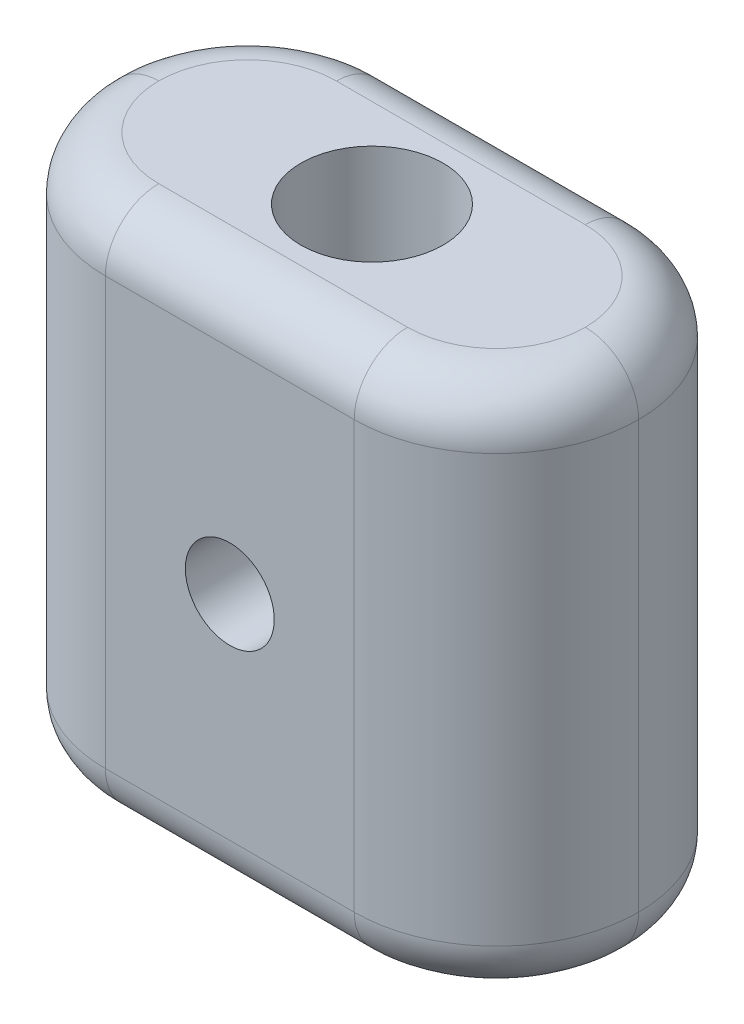
ISO-10303-21;
HEADER;
FILE_DESCRIPTION(('STEP AP214'),'2;1');
FILE_NAME('part.step','',(''),(''),'','','');
FILE_SCHEMA(('AUTOMOTIVE_DESIGN { 1 0 10303 214 1 1 1 1 }'));
ENDSEC;
DATA;
#1=APPLICATION_CONTEXT('core data for automotive mechanical design processes');
#2=APPLICATION_PROTOCOL_DEFINITION('international standard','automotive_design',2000,#1);
#3=PRODUCT_CONTEXT('',#1,'mechanical');
#4=PRODUCT('Part','Part','',(#3));
#5=PRODUCT_RELATED_PRODUCT_CATEGORY('part','',(#4));
#6=PRODUCT_DEFINITION_FORMATION('','',#4);
#7=PRODUCT_DEFINITION_CONTEXT('part definition',#1,'design');
#8=PRODUCT_DEFINITION('design','',#6,#7);
#9=PRODUCT_DEFINITION_SHAPE('','',#8);
#10=(LENGTH_UNIT() NAMED_UNIT(*) SI_UNIT(.MILLI.,.METRE.));
#11=(NAMED_UNIT(*) PLANE_ANGLE_UNIT() SI_UNIT($,.RADIAN.));
#12=(NAMED_UNIT(*) SI_UNIT($,.STERADIAN.) SOLID_ANGLE_UNIT());
#13=UNCERTAINTY_MEASURE_WITH_UNIT(LENGTH_MEASURE(1.E-05),#10,'distance_accuracy_value','');
#14=(GEOMETRIC_REPRESENTATION_CONTEXT(3) GLOBAL_UNCERTAINTY_ASSIGNED_CONTEXT((#13)) GLOBAL_UNIT_ASSIGNED_CONTEXT((#10,
#11,#12)) REPRESENTATION_CONTEXT('',''));
#15=CARTESIAN_POINT('',(0.,0.,0.));
#16=DIRECTION('',(0.,0.,1.));
#17=DIRECTION('',(1.,0.,0.));
#18=AXIS2_PLACEMENT_3D('',#15,#16,#17);
#19=CARTESIAN_POINT('',(15.,15.,16.));
#20=DIRECTION('',(0.,0.,-1.));
#21=DIRECTION('',(-1.,0.,0.));
#22=AXIS2_PLACEMENT_3D('',#19,#20,#21);
#23=CYLINDRICAL_SURFACE('',#22,2.5);
#24=CARTESIAN_POINT('',(12.5,15.,11.1224989991992));
#25=CARTESIAN_POINT('',(12.5000005890286,15.0621567514455,11.1224999155542));
#26=CARTESIAN_POINT('',(12.5023241805783,15.1243259466708,11.1243649073392));
#27=CARTESIAN_POINT('',(12.5115665015914,15.2481171795477,11.1317292311903));
#28=CARTESIAN_POINT('',(12.5184879375157,15.3097388732571,11.1372307038136));
#29=CARTESIAN_POINT('',(12.5460240494164,15.4932260477437,11.158889535585));
#30=CARTESIAN_POINT('',(12.5734100905354,15.613548331189,11.1802003627114));
#31=CARTESIAN_POINT('',(12.644237828588,15.8455981978782,11.2329977076037));
#32=CARTESIAN_POINT('',(12.687540386408,15.9573904150551,11.2643957538321));
#33=CARTESIAN_POINT('',(12.788560835691,16.1720085253341,11.3336600088444));
#34=CARTESIAN_POINT('',(12.8462791203698,16.2748341737531,11.3715263940553));
#35=CARTESIAN_POINT('',(12.9835231757442,16.4837339813037,11.4555922512188));
#36=CARTESIAN_POINT('',(13.0649357433305,16.5883933250045,11.5022281451158));
#37=CARTESIAN_POINT('',(13.2433747334257,16.7837615516238,11.5950550353337));
#38=CARTESIAN_POINT('',(13.3404146110022,16.8744582799536,11.6412456115844));
#39=CARTESIAN_POINT('',(13.5616600941715,17.0502202981727,11.7345952477131));
#40=CARTESIAN_POINT('',(13.6877306574035,17.1332861844504,11.781198877815));
#41=CARTESIAN_POINT('',(13.8883660445657,17.2405451547362,11.8430725183877));
#42=CARTESIAN_POINT('',(13.957187590259,17.2734151383331,11.8623628309205));
#43=CARTESIAN_POINT('',(14.0982412323844,17.3329546853633,11.8977043697544));
#44=CARTESIAN_POINT('',(14.1704709316062,17.3596285310384,11.9137578320712));
#45=CARTESIAN_POINT('',(14.3102997020834,17.4039838152563,11.9406675911382));
#46=CARTESIAN_POINT('',(14.3776280187214,17.4223019765181,11.9518853598447));
#47=CARTESIAN_POINT('',(14.5140024241012,17.4533022863134,11.9709624190916));
#48=CARTESIAN_POINT('',(14.5830474965583,17.4659876892162,11.9788236487972));
#49=CARTESIAN_POINT('',(14.7222345501428,17.4855137976345,11.9909547033474));
#50=CARTESIAN_POINT('',(14.7923758257561,17.4923581165134,11.9952267484783));
#51=CARTESIAN_POINT('',(14.9330885533401,17.5000992133892,12.0000612507244));
#52=CARTESIAN_POINT('',(15.0036599548603,17.5009966759633,12.0006241348225));
#53=CARTESIAN_POINT('',(15.1960450815555,17.4952746264527,11.997044796195));
#54=CARTESIAN_POINT('',(15.3176818454885,17.4826934969211,11.9891704089744));
#55=CARTESIAN_POINT('',(15.5566364946203,17.4402697820339,11.9629090327593));
#56=CARTESIAN_POINT('',(15.6739540526774,17.4104258920264,11.9445212492048));
#57=CARTESIAN_POINT('',(15.9017719917639,17.3347914407167,11.8987617071161));
#58=CARTESIAN_POINT('',(16.0122540715961,17.2889600804289,11.8713669738105));
#59=CARTESIAN_POINT('',(16.2240401207122,17.1830627610157,11.8097129175135));
#60=CARTESIAN_POINT('',(16.3253419917424,17.1229935589364,11.7754520308932));
#61=CARTESIAN_POINT('',(16.5294264974466,16.9819435830763,11.6978644124717));
#62=CARTESIAN_POINT('',(16.6308245461291,16.8992907233095,11.6539400638152));
#63=CARTESIAN_POINT('',(16.8191973357306,16.7197352627929,11.5639092774051));
#64=CARTESIAN_POINT('',(16.9061507184262,16.622811953616,11.5177997357041));
#65=CARTESIAN_POINT('',(17.0747088716791,16.4025887468265,11.4214288346447));
#66=CARTESIAN_POINT('',(17.1541322967784,16.2774972366419,11.371411626866));
#67=CARTESIAN_POINT('',(17.2905230755056,16.0127077626986,11.2802827819238));
#68=CARTESIAN_POINT('',(17.347531794485,15.8730373125469,11.2391548038693));
#69=CARTESIAN_POINT('',(17.4243713352793,15.6204611938938,11.1818375313176));
#70=CARTESIAN_POINT('',(17.450036834454,15.5101780747865,11.1619340860251));
#71=CARTESIAN_POINT('',(17.4862033707309,15.2857696224401,11.1335827775955));
#72=CARTESIAN_POINT('',(17.4967251252081,15.1716497573432,11.1251192650444));
#73=CARTESIAN_POINT('',(17.5019707209518,14.9425426394976,11.1209226703068));
#74=CARTESIAN_POINT('',(17.4966583589669,14.8275539995215,11.1252187617019));
#75=CARTESIAN_POINT('',(17.4705146636781,14.6004388356815,11.1459208583619));
#76=CARTESIAN_POINT('',(17.4496704784913,14.4883147616288,11.1623368922291));
#77=CARTESIAN_POINT('',(17.3940987419504,14.2715632405743,11.2046012079714));
#78=CARTESIAN_POINT('',(17.3596057142476,14.1668426841057,11.2302895436782));
#79=CARTESIAN_POINT('',(17.2780489370224,13.9644253001062,11.2883114838875));
#80=CARTESIAN_POINT('',(17.2309807258375,13.866730981122,11.3206474460208));
#81=CARTESIAN_POINT('',(17.1153079873069,13.6613880583368,11.395744012852));
#82=CARTESIAN_POINT('',(17.0443093116054,13.5553854726982,11.4393172429302));
#83=CARTESIAN_POINT('',(16.8873786892149,13.3556293393457,11.5278794321334));
#84=CARTESIAN_POINT('',(16.8014312490262,13.2618886787577,11.5728698200447));
#85=CARTESIAN_POINT('',(16.6007693249212,13.074035929359,11.667662094595));
#86=CARTESIAN_POINT('',(16.4836520161718,12.9822726015151,11.717079338832));
#87=CARTESIAN_POINT('',(16.2325678740781,12.8198529852803,11.8076897339861));
#88=CARTESIAN_POINT('',(16.0986089794097,12.7491868048731,11.8488867361901));
#89=CARTESIAN_POINT('',(15.8919308046551,12.663418932025,11.8998896649978));
#90=CARTESIAN_POINT('',(15.8243181960394,12.6387025560487,11.9147705509724));
#91=CARTESIAN_POINT('',(15.6866407928764,12.5950617232677,11.9412464391862));
#92=CARTESIAN_POINT('',(15.6165774440511,12.5761339138491,11.952843343148));
#93=CARTESIAN_POINT('',(15.4746392314643,12.5443941698607,11.9723851203995));
#94=CARTESIAN_POINT('',(15.4027660057555,12.5315769004836,11.9803331790884));
#95=CARTESIAN_POINT('',(15.2578818071425,12.5122608277071,11.9923416834334));
#96=CARTESIAN_POINT('',(15.1848710244825,12.5057609790692,11.9964027722002));
#97=CARTESIAN_POINT('',(14.9868897225751,12.4969284844929,12.0019152149271));
#98=CARTESIAN_POINT('',(14.8614609207946,12.5007342070906,11.9995270612395));
#99=CARTESIAN_POINT('',(14.6134168628979,12.5269175895455,11.9832197501836));
#100=CARTESIAN_POINT('',(14.4908014793732,12.5492944066788,11.9693011160486));
#101=CARTESIAN_POINT('',(14.2559193945162,12.6103224155461,11.9319208338428));
#102=CARTESIAN_POINT('',(14.1434412473682,12.6483820735647,11.908807010548));
#103=CARTESIAN_POINT('',(13.9265696527808,12.7391194624435,11.8548997124884));
#104=CARTESIAN_POINT('',(13.822177573142,12.7917996595672,11.8241049421531));
#105=CARTESIAN_POINT('',(13.612687022452,12.91632127872,11.7535067393565));
#106=CARTESIAN_POINT('',(13.5086398781622,12.9895839907575,11.7131000186466));
#107=CARTESIAN_POINT('',(13.313566650652,13.1501532325141,11.6286728398521));
#108=CARTESIAN_POINT('',(13.2225554815632,13.2374756088343,11.584648331912));
#109=CARTESIAN_POINT('',(13.0425528343841,13.4382325150619,11.4900082821972));
#110=CARTESIAN_POINT('',(12.9557433874994,13.5536166125714,11.439357384271));
#111=CARTESIAN_POINT('',(12.802453514901,13.7992894097598,11.3434964745711));
#112=CARTESIAN_POINT('',(12.7359618458497,13.9295698111525,11.2982834620419));
#113=CARTESIAN_POINT('',(12.6380177058716,14.1728053007849,11.2285953978009));
#114=CARTESIAN_POINT('',(12.6020754142317,14.2832705721536,11.2017463933877));
#115=CARTESIAN_POINT('',(12.5457438158025,14.5099393430018,11.1587835810451));
#116=CARTESIAN_POINT('',(12.5253052758983,14.6261234197997,11.1426358115043));
#117=CARTESIAN_POINT('',(12.5088015286048,14.7860599946461,11.1295285764061));
#118=CARTESIAN_POINT('',(12.5055056616204,14.8287255257087,11.1268999430677));
#119=CARTESIAN_POINT('',(12.5011044187419,14.9142586989517,11.1233846193986));
#120=CARTESIAN_POINT('',(12.4999995937081,14.9571263892434,11.1224983671287));
#121=CARTESIAN_POINT('',(12.5,15.,11.1224989991992));
#122=B_SPLINE_CURVE_WITH_KNOTS('',3,(#24,#25,#26,#27,#28,#29,#30,#31,#32,#33,#34,#35,#36,#37,
#38,#39,#40,#41,#42,#43,#44,#45,#46,#47,#48,#49,#50,#51,#52,#53,#54,#55,#56,#57,#58,#59,#60,#61,
#62,#63,#64,#65,#66,#67,#68,#69,#70,#71,#72,#73,#74,#75,#76,#77,#78,#79,#80,#81,#82,#83,#84,#85,
#86,#87,#88,#89,#90,#91,#92,#93,#94,#95,#96,#97,#98,#99,#100,#101,#102,#103,#104,#105,#106,#107,
#108,#109,#110,#111,#112,#113,#114,#115,#116,#117,#118,#119,#120,#121),.UNSPECIFIED.,.T.,.F.,(4,
2,2,2,2,2,2,2,2,2,2,2,2,2,2,2,2,2,2,2,2,2,2,2,2,2,2,2,2,2,2,2,2,2,2,2,2,2,2,2,2,2,2,2,2,2,2,2,
4),(0.,0.186415315858459,0.372940459994495,0.746478880764685,1.11682668423132,1.48718459072605,
1.9072279868507,2.32763499192879,2.7987602926597,3.03445880867314,3.26999394209509,
3.48170145743205,3.69328649746503,3.90474055342595,4.11617026725867,4.48184709708114,
4.84755156693919,5.21419620193004,5.58092442797434,5.99329080205307,6.40626158573465,
6.87316206383505,7.33919680735486,7.68265621505465,8.02564530559509,8.36941921026407,
8.7134778886509,9.05186495232125,9.390372235192,9.79332737765187,10.1967026751544,
10.6647326786671,11.1325428866818,11.3527929661039,11.5729152387446,11.7928449800804,
12.0127383271002,12.3871595324234,12.7615637480926,13.1229788842094,13.4844550226785,
13.8834503840958,14.2828986410983,14.7399238503459,15.1966956936287,15.5530255473292,
15.9082190611886,16.0367696833384,16.1653526209168),.UNSPECIFIED.);
#123=CARTESIAN_POINT('',(12.5,15.,11.1224989991992));
#124=VERTEX_POINT('',#123);
#125=EDGE_CURVE('E258',#124,#124,#122,.T.);
#126=ORIENTED_EDGE('',*,*,#125,.T.);
#127=EDGE_LOOP('',(#126));
#128=FACE_BOUND('',#127,.T.);
#129=CARTESIAN_POINT('',(15.,15.,16.));
#130=DIRECTION('',(0.,0.,-1.));
#131=DIRECTION('',(-1.,0.,0.));
#132=AXIS2_PLACEMENT_3D('',#129,#130,#131);
#133=CIRCLE('',#132,2.5);
#134=CARTESIAN_POINT('',(12.5,15.,16.));
#135=VERTEX_POINT('',#134);
#136=EDGE_CURVE('E251',#135,#135,#133,.T.);
#137=ORIENTED_EDGE('',*,*,#136,.F.);
#138=EDGE_LOOP('',(#137));
#139=FACE_BOUND('',#138,.T.);
#140=ADVANCED_FACE('F38',(#128,#139),#23,.F.);
#141=CARTESIAN_POINT('',(0.,0.,16.));
#142=DIRECTION('',(0.,1.,0.));
#143=DIRECTION('',(0.,0.,1.));
#144=AXIS2_PLACEMENT_3D('',#141,#142,#143);
#145=PLANE('',#144);
#146=DIRECTION('',(1.,0.,0.));
#147=VECTOR('',#146,1.);
#148=CARTESIAN_POINT('',(0.,0.,13.));
#149=LINE('',#148,#147);
#150=CARTESIAN_POINT('',(22.,0.,13.));
#151=VERTEX_POINT('',#150);
#152=CARTESIAN_POINT('',(8.,0.,13.));
#153=VERTEX_POINT('',#152);
#154=EDGE_CURVE('E135',#151,#153,#149,.F.);
#155=ORIENTED_EDGE('',*,*,#154,.T.);
#156=CARTESIAN_POINT('',(8.,0.,8.));
#157=DIRECTION('',(0.,1.,0.));
#158=DIRECTION('',(0.,0.,1.));
#159=AXIS2_PLACEMENT_3D('',#156,#157,#158);
#160=CIRCLE('',#159,5.);
#161=CARTESIAN_POINT('',(3.,0.,8.));
#162=VERTEX_POINT('',#161);
#163=EDGE_CURVE('E170',#153,#162,#160,.F.);
#164=ORIENTED_EDGE('',*,*,#163,.T.);
#165=CARTESIAN_POINT('',(8.,0.,8.));
#166=DIRECTION('',(0.,1.,0.));
#167=DIRECTION('',(0.,0.,1.));
#168=AXIS2_PLACEMENT_3D('',#165,#166,#167);
#169=CIRCLE('',#168,5.);
#170=CARTESIAN_POINT('',(8.,0.,3.));
#171=VERTEX_POINT('',#170);
#172=EDGE_CURVE('E168',#162,#171,#169,.F.);
#173=ORIENTED_EDGE('',*,*,#172,.T.);
#174=DIRECTION('',(1.,0.,0.));
#175=VECTOR('',#174,1.);
#176=CARTESIAN_POINT('',(22.,0.,3.));
#177=LINE('',#176,#175);
#178=CARTESIAN_POINT('',(22.,0.,3.));
#179=VERTEX_POINT('',#178);
#180=EDGE_CURVE('E166',#171,#179,#177,.T.);
#181=ORIENTED_EDGE('',*,*,#180,.T.);
#182=CARTESIAN_POINT('',(22.,0.,8.));
#183=DIRECTION('',(0.,1.,0.));
#184=DIRECTION('',(0.,0.,1.));
#185=AXIS2_PLACEMENT_3D('',#182,#183,#184);
#186=CIRCLE('',#185,5.);
#187=CARTESIAN_POINT('',(27.,0.,8.));
#188=VERTEX_POINT('',#187);
#189=EDGE_CURVE('E138',#179,#188,#186,.F.);
#190=ORIENTED_EDGE('',*,*,#189,.T.);
#191=CARTESIAN_POINT('',(22.,0.,8.));
#192=DIRECTION('',(0.,1.,0.));
#193=DIRECTION('',(0.,0.,1.));
#194=AXIS2_PLACEMENT_3D('',#191,#192,#193);
#195=CIRCLE('',#194,5.);
#196=EDGE_CURVE('E129',#188,#151,#195,.F.);
#197=ORIENTED_EDGE('',*,*,#196,.T.);
#198=EDGE_LOOP('',(#155,#164,#173,#181,#190,#197));
#199=FACE_BOUND('',#198,.T.);
#200=CARTESIAN_POINT('',(15.,0.,8.));
#201=DIRECTION('',(0.,1.,0.));
#202=DIRECTION('',(0.,0.,1.));
#203=AXIS2_PLACEMENT_3D('',#200,#201,#202);
#204=CIRCLE('',#203,4.);
#205=CARTESIAN_POINT('',(15.,0.,12.));
#206=VERTEX_POINT('',#205);
#207=EDGE_CURVE('E274',#206,#206,#204,.T.);
#208=ORIENTED_EDGE('',*,*,#207,.T.);
#209=EDGE_LOOP('',(#208));
#210=FACE_BOUND('',#209,.T.);
#211=ADVANCED_FACE('F131',(#199,#210),#145,.F.);
#212=CARTESIAN_POINT('',(0.,30.,16.));
#213=DIRECTION('',(0.,-1.,0.));
#214=DIRECTION('',(0.,0.,-1.));
#215=AXIS2_PLACEMENT_3D('',#212,#213,#214);
#216=PLANE('',#215);
#217=DIRECTION('',(-1.,0.,0.));
#218=VECTOR('',#217,1.);
#219=CARTESIAN_POINT('',(0.,30.,13.));
#220=LINE('',#219,#218);
#221=CARTESIAN_POINT('',(8.,30.,13.));
#222=VERTEX_POINT('',#221);
#223=CARTESIAN_POINT('',(22.,30.,13.));
#224=VERTEX_POINT('',#223);
#225=EDGE_CURVE('E193',#222,#224,#220,.F.);
#226=ORIENTED_EDGE('',*,*,#225,.T.);
#227=CARTESIAN_POINT('',(22.,30.,8.));
#228=DIRECTION('',(0.,-1.,0.));
#229=DIRECTION('',(0.,0.,-1.));
#230=AXIS2_PLACEMENT_3D('',#227,#228,#229);
#231=CIRCLE('',#230,5.);
#232=CARTESIAN_POINT('',(27.,30.,8.));
#233=VERTEX_POINT('',#232);
#234=EDGE_CURVE('E202',#224,#233,#231,.F.);
#235=ORIENTED_EDGE('',*,*,#234,.T.);
#236=CARTESIAN_POINT('',(22.,30.,8.));
#237=DIRECTION('',(0.,-1.,0.));
#238=DIRECTION('',(0.,0.,-1.));
#239=AXIS2_PLACEMENT_3D('',#236,#237,#238);
#240=CIRCLE('',#239,5.);
#241=CARTESIAN_POINT('',(22.,30.,3.));
#242=VERTEX_POINT('',#241);
#243=EDGE_CURVE('E62',#233,#242,#240,.F.);
#244=ORIENTED_EDGE('',*,*,#243,.T.);
#245=DIRECTION('',(-1.,0.,0.));
#246=VECTOR('',#245,1.);
#247=CARTESIAN_POINT('',(8.,30.,3.));
#248=LINE('',#247,#246);
#249=CARTESIAN_POINT('',(8.,30.,3.));
#250=VERTEX_POINT('',#249);
#251=EDGE_CURVE('E199',#242,#250,#248,.T.);
#252=ORIENTED_EDGE('',*,*,#251,.T.);
#253=CARTESIAN_POINT('',(8.,30.,8.));
#254=DIRECTION('',(0.,-1.,0.));
#255=DIRECTION('',(0.,0.,-1.));
#256=AXIS2_PLACEMENT_3D('',#253,#254,#255);
#257=CIRCLE('',#256,5.);
#258=CARTESIAN_POINT('',(3.,30.,8.));
#259=VERTEX_POINT('',#258);
#260=EDGE_CURVE('E197',#250,#259,#257,.F.);
#261=ORIENTED_EDGE('',*,*,#260,.T.);
#262=CARTESIAN_POINT('',(8.,30.,8.));
#263=DIRECTION('',(0.,-1.,0.));
#264=DIRECTION('',(0.,0.,-1.));
#265=AXIS2_PLACEMENT_3D('',#262,#263,#264);
#266=CIRCLE('',#265,5.);
#267=EDGE_CURVE('E195',#259,#222,#266,.F.);
#268=ORIENTED_EDGE('',*,*,#267,.T.);
#269=EDGE_LOOP('',(#226,#235,#244,#252,#261,#268));
#270=FACE_BOUND('',#269,.T.);
#271=CARTESIAN_POINT('',(15.,30.,8.));
#272=DIRECTION('',(0.,1.,0.));
#273=DIRECTION('',(0.,0.,1.));
#274=AXIS2_PLACEMENT_3D('',#271,#272,#273);
#275=CIRCLE('',#274,4.);
#276=CARTESIAN_POINT('',(15.,30.,12.));
#277=VERTEX_POINT('',#276);
#278=EDGE_CURVE('E269',#277,#277,#275,.T.);
#279=ORIENTED_EDGE('',*,*,#278,.F.);
#280=EDGE_LOOP('',(#279));
#281=FACE_BOUND('',#280,.T.);
#282=ADVANCED_FACE('F311',(#270,#281),#216,.F.);
#283=CARTESIAN_POINT('',(0.,0.,16.));
#284=DIRECTION('',(0.,0.,-1.));
#285=DIRECTION('',(-1.,0.,0.));
#286=AXIS2_PLACEMENT_3D('',#283,#284,#285);
#287=PLANE('',#286);
#288=ORIENTED_EDGE('',*,*,#136,.T.);
#289=EDGE_LOOP('',(#288));
#290=FACE_BOUND('',#289,.T.);
#291=DIRECTION('',(0.,-1.,0.));
#292=VECTOR('',#291,1.);
#293=CARTESIAN_POINT('',(8.,0.,16.));
#294=LINE('',#293,#292);
#295=CARTESIAN_POINT('',(8.,27.,16.));
#296=VERTEX_POINT('',#295);
#297=CARTESIAN_POINT('',(8.,3.,16.));
#298=VERTEX_POINT('',#297);
#299=EDGE_CURVE('E159',#296,#298,#294,.T.);
#300=ORIENTED_EDGE('',*,*,#299,.T.);
#301=DIRECTION('',(1.,0.,0.));
#302=VECTOR('',#301,1.);
#303=CARTESIAN_POINT('',(0.,3.,16.));
#304=LINE('',#303,#302);
#305=CARTESIAN_POINT('',(22.,3.,16.));
#306=VERTEX_POINT('',#305);
#307=EDGE_CURVE('E11',#298,#306,#304,.T.);
#308=ORIENTED_EDGE('',*,*,#307,.T.);
#309=DIRECTION('',(0.,1.,0.));
#310=VECTOR('',#309,1.);
#311=CARTESIAN_POINT('',(22.,0.,16.));
#312=LINE('',#311,#310);
#313=CARTESIAN_POINT('',(22.,27.,16.));
#314=VERTEX_POINT('',#313);
#315=EDGE_CURVE('E156',#306,#314,#312,.T.);
#316=ORIENTED_EDGE('',*,*,#315,.T.);
#317=DIRECTION('',(-1.,0.,0.));
#318=VECTOR('',#317,1.);
#319=CARTESIAN_POINT('',(0.,27.,16.));
#320=LINE('',#319,#318);
#321=EDGE_CURVE('E47',#314,#296,#320,.T.);
#322=ORIENTED_EDGE('',*,*,#321,.T.);
#323=EDGE_LOOP('',(#300,#308,#316,#322));
#324=FACE_BOUND('',#323,.T.);
#325=ADVANCED_FACE('F318',(#290,#324),#287,.F.);
#326=CARTESIAN_POINT('',(0.,0.,0.));
#327=DIRECTION('',(0.,0.,-1.));
#328=DIRECTION('',(-1.,0.,0.));
#329=AXIS2_PLACEMENT_3D('',#326,#327,#328);
#330=PLANE('',#329);
#331=CARTESIAN_POINT('',(15.,15.,0.));
#332=DIRECTION('',(0.,0.,-1.));
#333=DIRECTION('',(-1.,0.,0.));
#334=AXIS2_PLACEMENT_3D('',#331,#332,#333);
#335=CIRCLE('',#334,2.5);
#336=CARTESIAN_POINT('',(12.5,15.,0.));
#337=VERTEX_POINT('',#336);
#338=EDGE_CURVE('E255',#337,#337,#335,.T.);
#339=ORIENTED_EDGE('',*,*,#338,.F.);
#340=EDGE_LOOP('',(#339));
#341=FACE_BOUND('',#340,.T.);
#342=DIRECTION('',(0.,1.,0.));
#343=VECTOR('',#342,1.);
#344=CARTESIAN_POINT('',(22.,0.,0.));
#345=LINE('',#344,#343);
#346=CARTESIAN_POINT('',(22.,27.,0.));
#347=VERTEX_POINT('',#346);
#348=CARTESIAN_POINT('',(22.,3.,0.));
#349=VERTEX_POINT('',#348);
#350=EDGE_CURVE('E250',#347,#349,#345,.F.);
#351=ORIENTED_EDGE('',*,*,#350,.T.);
#352=DIRECTION('',(1.,0.,0.));
#353=VECTOR('',#352,1.);
#354=CARTESIAN_POINT('',(8.,3.,0.));
#355=LINE('',#354,#353);
#356=CARTESIAN_POINT('',(8.,3.,0.));
#357=VERTEX_POINT('',#356);
#358=EDGE_CURVE('E183',#349,#357,#355,.F.);
#359=ORIENTED_EDGE('',*,*,#358,.T.);
#360=DIRECTION('',(0.,-1.,0.));
#361=VECTOR('',#360,1.);
#362=CARTESIAN_POINT('',(8.,30.,0.));
#363=LINE('',#362,#361);
#364=CARTESIAN_POINT('',(8.,27.,0.));
#365=VERTEX_POINT('',#364);
#366=EDGE_CURVE('E242',#357,#365,#363,.F.);
#367=ORIENTED_EDGE('',*,*,#366,.T.);
#368=DIRECTION('',(-1.,0.,0.));
#369=VECTOR('',#368,1.);
#370=CARTESIAN_POINT('',(22.,27.,0.));
#371=LINE('',#370,#369);
#372=EDGE_CURVE('E181',#365,#347,#371,.F.);
#373=ORIENTED_EDGE('',*,*,#372,.T.);
#374=EDGE_LOOP('',(#351,#359,#367,#373));
#375=FACE_BOUND('',#374,.T.);
#376=ADVANCED_FACE('F247',(#341,#375),#330,.T.);
#377=CARTESIAN_POINT('',(12.5,15.,4.8775010008008));
#378=CARTESIAN_POINT('',(12.5000005890286,14.9378432485545,4.87750008444579));
#379=CARTESIAN_POINT('',(12.5023241805783,14.8756740533292,4.87563509266084));
#380=CARTESIAN_POINT('',(12.5115665015914,14.7518828204523,4.86827076880975));
#381=CARTESIAN_POINT('',(12.5184879375157,14.6902611267429,4.86276929618636));
#382=CARTESIAN_POINT('',(12.5460240494164,14.5067739522563,4.84111046441495));
#383=CARTESIAN_POINT('',(12.5734100905354,14.386451668811,4.81979963728858));
#384=CARTESIAN_POINT('',(12.644237828588,14.1544018021218,4.76700229239633));
#385=CARTESIAN_POINT('',(12.687540386408,14.0426095849449,4.73560424616791));
#386=CARTESIAN_POINT('',(12.788560835691,13.8279914746659,4.66633999115561));
#387=CARTESIAN_POINT('',(12.8462791203698,13.7251658262469,4.62847360594466));
#388=CARTESIAN_POINT('',(12.9835231757442,13.5162660186963,4.54440774878124));
#389=CARTESIAN_POINT('',(13.0649357433305,13.4116066749955,4.49777185488422));
#390=CARTESIAN_POINT('',(13.2433747334257,13.2162384483762,4.40494496466632));
#391=CARTESIAN_POINT('',(13.3404146110022,13.1255417200464,4.35875438841562));
#392=CARTESIAN_POINT('',(13.5616600941715,12.9497797018273,4.26540475228686));
#393=CARTESIAN_POINT('',(13.6877306574035,12.8667138155496,4.21880112218496));
#394=CARTESIAN_POINT('',(13.8883660445657,12.7594548452638,4.15692748161226));
#395=CARTESIAN_POINT('',(13.957187590259,12.7265848616669,4.13763716907949));
#396=CARTESIAN_POINT('',(14.0982412323844,12.6670453146367,4.10229563024564));
#397=CARTESIAN_POINT('',(14.1704709316062,12.6403714689616,4.08624216792882));
#398=CARTESIAN_POINT('',(14.3102997020834,12.5960161847437,4.05933240886177));
#399=CARTESIAN_POINT('',(14.3776280187214,12.5776980234819,4.04811464015534));
#400=CARTESIAN_POINT('',(14.5140024241012,12.5466977136866,4.02903758090839));
#401=CARTESIAN_POINT('',(14.5830474965583,12.5340123107838,4.02117635120279));
#402=CARTESIAN_POINT('',(14.7222345501428,12.5144862023655,4.00904529665263));
#403=CARTESIAN_POINT('',(14.7923758257561,12.5076418834866,4.00477325152166));
#404=CARTESIAN_POINT('',(14.9330885533401,12.4999007866108,3.99993874927563));
#405=CARTESIAN_POINT('',(15.0036599548603,12.4990033240366,3.99937586517752));
#406=CARTESIAN_POINT('',(15.1960450815555,12.5047253735473,4.00295520380497));
#407=CARTESIAN_POINT('',(15.3176818454885,12.5173065030789,4.01082959102564));
#408=CARTESIAN_POINT('',(15.5566364946203,12.5597302179661,4.03709096724069));
#409=CARTESIAN_POINT('',(15.6739540526774,12.5895741079736,4.05547875079523));
#410=CARTESIAN_POINT('',(15.9017719917639,12.6652085592833,4.10123829288391));
#411=CARTESIAN_POINT('',(16.0122540715961,12.7110399195711,4.12863302618953));
#412=CARTESIAN_POINT('',(16.2240401207122,12.8169372389843,4.19028708248646));
#413=CARTESIAN_POINT('',(16.3253419917424,12.8770064410636,4.22454796910682));
#414=CARTESIAN_POINT('',(16.5294264974466,13.0180564169237,4.30213558752833));
#415=CARTESIAN_POINT('',(16.6308245461291,13.1007092766905,4.34605993618479));
#416=CARTESIAN_POINT('',(16.8191973357306,13.2802647372071,4.43609072259493));
#417=CARTESIAN_POINT('',(16.9061507184262,13.377188046384,4.48220026429591));
#418=CARTESIAN_POINT('',(17.0747088716791,13.5974112531735,4.57857116535534));
#419=CARTESIAN_POINT('',(17.1541322967784,13.7225027633581,4.62858837313403));
#420=CARTESIAN_POINT('',(17.2905230755056,13.9872922373014,4.71971721807618));
#421=CARTESIAN_POINT('',(17.347531794485,14.1269626874531,4.76084519613069));
#422=CARTESIAN_POINT('',(17.4243713352793,14.3795388061062,4.81816246868237));
#423=CARTESIAN_POINT('',(17.450036834454,14.4898219252135,4.83806591397487));
#424=CARTESIAN_POINT('',(17.4862033707309,14.7142303775599,4.86641722240453));
#425=CARTESIAN_POINT('',(17.4967251252081,14.8283502426568,4.87488073495561));
#426=CARTESIAN_POINT('',(17.5019707209518,15.0574573605024,4.87907732969323));
#427=CARTESIAN_POINT('',(17.4966583589669,15.1724460004785,4.87478123829815));
#428=CARTESIAN_POINT('',(17.4705146636781,15.3995611643185,4.85407914163812));
#429=CARTESIAN_POINT('',(17.4496704784913,15.5116852383712,4.83766310777094));
#430=CARTESIAN_POINT('',(17.3940987419504,15.7284367594257,4.79539879202857));
#431=CARTESIAN_POINT('',(17.3596057142476,15.8331573158943,4.76971045632183));
#432=CARTESIAN_POINT('',(17.2780489370224,16.0355746998938,4.71168851611251));
#433=CARTESIAN_POINT('',(17.2309807258375,16.133269018878,4.67935255397919));
#434=CARTESIAN_POINT('',(17.1153079873069,16.3386119416632,4.60425598714797));
#435=CARTESIAN_POINT('',(17.0443093116054,16.4446145273018,4.56068275706985));
#436=CARTESIAN_POINT('',(16.8873786892149,16.6443706606543,4.47212056786662));
#437=CARTESIAN_POINT('',(16.8014312490262,16.7381113212423,4.42713017995533));
#438=CARTESIAN_POINT('',(16.6007693249212,16.925964070641,4.33233790540495));
#439=CARTESIAN_POINT('',(16.4836520161718,17.0177273984849,4.28292066116799));
#440=CARTESIAN_POINT('',(16.2325678740781,17.1801470147197,4.19231026601394));
#441=CARTESIAN_POINT('',(16.0986089794097,17.2508131951269,4.15111326380991));
#442=CARTESIAN_POINT('',(15.8919308046551,17.336581067975,4.10011033500224));
#443=CARTESIAN_POINT('',(15.8243181960394,17.3612974439513,4.08522944902755));
#444=CARTESIAN_POINT('',(15.6866407928764,17.4049382767323,4.05875356081382));
#445=CARTESIAN_POINT('',(15.6165774440511,17.4238660861509,4.04715665685195));
#446=CARTESIAN_POINT('',(15.4746392314643,17.4556058301393,4.0276148796005));
#447=CARTESIAN_POINT('',(15.4027660057555,17.4684230995164,4.01966682091164));
#448=CARTESIAN_POINT('',(15.2578818071425,17.4877391722929,4.00765831656657));
#449=CARTESIAN_POINT('',(15.1848710244825,17.4942390209308,4.00359722779976));
#450=CARTESIAN_POINT('',(14.9868897225751,17.5030715155071,3.99808478507294));
#451=CARTESIAN_POINT('',(14.8614609207945,17.4992657929094,4.00047293876053));
#452=CARTESIAN_POINT('',(14.6134168628979,17.4730824104545,4.01678024981638));
#453=CARTESIAN_POINT('',(14.4908014793732,17.4507055933212,4.03069888395143));
#454=CARTESIAN_POINT('',(14.2559193945161,17.3896775844539,4.06807916615715));
#455=CARTESIAN_POINT('',(14.1434412473682,17.3516179264353,4.09119298945197));
#456=CARTESIAN_POINT('',(13.9265696527808,17.2608805375565,4.14510028751157));
#457=CARTESIAN_POINT('',(13.822177573142,17.2082003404328,4.17589505784691));
#458=CARTESIAN_POINT('',(13.612687022452,17.08367872128,4.24649326064352));
#459=CARTESIAN_POINT('',(13.5086398781622,17.0104160092425,4.28689998135343));
#460=CARTESIAN_POINT('',(13.313566650652,16.8498467674859,4.37132716014794));
#461=CARTESIAN_POINT('',(13.2225554815632,16.7625243911657,4.41535166808797));
#462=CARTESIAN_POINT('',(13.0425528343841,16.5617674849381,4.50999171780282));
#463=CARTESIAN_POINT('',(12.9557433874994,16.4463833874286,4.56064261572896));
#464=CARTESIAN_POINT('',(12.802453514901,16.2007105902402,4.65650352542888));
#465=CARTESIAN_POINT('',(12.7359618458497,16.0704301888475,4.7017165379581));
#466=CARTESIAN_POINT('',(12.6380177058716,15.8271946992151,4.77140460219909));
#467=CARTESIAN_POINT('',(12.6020754142317,15.7167294278464,4.79825360661231));
#468=CARTESIAN_POINT('',(12.5457438158025,15.4900606569982,4.8412164189549));
#469=CARTESIAN_POINT('',(12.5253052758983,15.3738765802003,4.85736418849572));
#470=CARTESIAN_POINT('',(12.5088015286048,15.2139400053539,4.87047142359393));
#471=CARTESIAN_POINT('',(12.5055056616204,15.1712744742913,4.8731000569323));
#472=CARTESIAN_POINT('',(12.5011044187419,15.0857413010483,4.87661538060138));
#473=CARTESIAN_POINT('',(12.4999995937081,15.0428736107566,4.87750163287129));
#474=CARTESIAN_POINT('',(12.5,15.,4.8775010008008));
#475=B_SPLINE_CURVE_WITH_KNOTS('',3,(#377,#378,#379,#380,#381,#382,#383,#384,#385,#386,#387,
#388,#389,#390,#391,#392,#393,#394,#395,#396,#397,#398,#399,#400,#401,#402,#403,#404,#405,#406,
#407,#408,#409,#410,#411,#412,#413,#414,#415,#416,#417,#418,#419,#420,#421,#422,#423,#424,#425,
#426,#427,#428,#429,#430,#431,#432,#433,#434,#435,#436,#437,#438,#439,#440,#441,#442,#443,#444,
#445,#446,#447,#448,#449,#450,#451,#452,#453,#454,#455,#456,#457,#458,#459,#460,#461,#462,#463,
#464,#465,#466,#467,#468,#469,#470,#471,#472,#473,#474),.UNSPECIFIED.,.T.,.F.,(4,2,2,2,2,2,2,2,
2,2,2,2,2,2,2,2,2,2,2,2,2,2,2,2,2,2,2,2,2,2,2,2,2,2,2,2,2,2,2,2,2,2,2,2,2,2,2,2,4),(0.,
0.186415315858459,0.372940459994495,0.746478880764687,1.11682668423133,1.48718459072605,
1.9072279868507,2.32763499192879,2.7987602926597,3.03445880867314,3.26999394209509,
3.48170145743205,3.69328649746503,3.90474055342595,4.11617026725867,4.48184709708114,
4.84755156693919,5.21419620193004,5.58092442797435,5.99329080205307,6.40626158573465,
6.87316206383505,7.33919680735486,7.68265621505466,8.02564530559509,8.36941921026407,
8.7134778886509,9.05186495232126,9.390372235192,9.79332737765188,10.1967026751544,
10.6647326786671,11.1325428866818,11.3527929661039,11.5729152387447,11.7928449800804,
12.0127383271002,12.3871595324234,12.7615637480926,13.1229788842094,13.4844550226785,
13.8834503840958,14.2828986410983,14.7399238503459,15.1966956936287,15.5530255473292,
15.9082190611886,16.0367696833384,16.1653526209168),.UNSPECIFIED.);
#476=CARTESIAN_POINT('',(12.5,15.,4.8775010008008));
#477=VERTEX_POINT('',#476);
#478=EDGE_CURVE('E279',#477,#477,#475,.T.);
#479=ORIENTED_EDGE('',*,*,#478,.T.);
#480=EDGE_LOOP('',(#479));
#481=FACE_BOUND('',#480,.T.);
#482=ORIENTED_EDGE('',*,*,#338,.T.);
#483=EDGE_LOOP('',(#482));
#484=FACE_BOUND('',#483,.T.);
#485=ADVANCED_FACE('F287',(#481,#484),#23,.F.);
#486=CARTESIAN_POINT('',(15.,0.,8.));
#487=DIRECTION('',(0.,1.,0.));
#488=DIRECTION('',(0.,0.,1.));
#489=AXIS2_PLACEMENT_3D('',#486,#487,#488);
#490=CYLINDRICAL_SURFACE('',#489,4.);
#491=ORIENTED_EDGE('',*,*,#478,.F.);
#492=EDGE_LOOP('',(#491));
#493=FACE_BOUND('',#492,.T.);
#494=ORIENTED_EDGE('',*,*,#207,.F.);
#495=EDGE_LOOP('',(#494));
#496=FACE_BOUND('',#495,.T.);
#497=ORIENTED_EDGE('',*,*,#278,.T.);
#498=EDGE_LOOP('',(#497));
#499=FACE_BOUND('',#498,.T.);
#500=ORIENTED_EDGE('',*,*,#125,.F.);
#501=EDGE_LOOP('',(#500));
#502=FACE_BOUND('',#501,.T.);
#503=ADVANCED_FACE('F290',(#493,#496,#499,#502),#490,.F.);
#504=CARTESIAN_POINT('',(22.,0.,8.));
#505=DIRECTION('',(0.,1.,0.));
#506=DIRECTION('',(0.,0.,1.));
#507=AXIS2_PLACEMENT_3D('',#504,#505,#506);
#508=CYLINDRICAL_SURFACE('',#507,8.);
#509=ORIENTED_EDGE('',*,*,#315,.F.);
#510=CARTESIAN_POINT('',(22.,3.,8.));
#511=DIRECTION('',(0.,1.,0.));
#512=DIRECTION('',(0.,0.,1.));
#513=AXIS2_PLACEMENT_3D('',#510,#511,#512);
#514=CIRCLE('',#513,8.);
#515=CARTESIAN_POINT('',(30.,3.,8.));
#516=VERTEX_POINT('',#515);
#517=EDGE_CURVE('E147',#306,#516,#514,.T.);
#518=ORIENTED_EDGE('',*,*,#517,.T.);
#519=DIRECTION('',(0.,1.,0.));
#520=VECTOR('',#519,1.);
#521=CARTESIAN_POINT('',(30.,0.,8.));
#522=LINE('',#521,#520);
#523=CARTESIAN_POINT('',(30.,27.,8.));
#524=VERTEX_POINT('',#523);
#525=EDGE_CURVE('E267',#524,#516,#522,.F.);
#526=ORIENTED_EDGE('',*,*,#525,.F.);
#527=CARTESIAN_POINT('',(22.,27.,8.));
#528=DIRECTION('',(0.,-1.,0.));
#529=DIRECTION('',(0.,0.,-1.));
#530=AXIS2_PLACEMENT_3D('',#527,#528,#529);
#531=CIRCLE('',#530,8.);
#532=EDGE_CURVE('E189',#524,#314,#531,.T.);
#533=ORIENTED_EDGE('',*,*,#532,.T.);
#534=EDGE_LOOP('',(#509,#518,#526,#533));
#535=FACE_BOUND('',#534,.T.);
#536=ADVANCED_FACE('F293',(#535),#508,.T.);
#537=CARTESIAN_POINT('',(22.,0.,8.));
#538=DIRECTION('',(0.,-1.,0.));
#539=DIRECTION('',(0.,0.,-1.));
#540=AXIS2_PLACEMENT_3D('',#537,#538,#539);
#541=CYLINDRICAL_SURFACE('',#540,8.);
#542=ORIENTED_EDGE('',*,*,#525,.T.);
#543=CARTESIAN_POINT('',(22.,3.,8.));
#544=DIRECTION('',(0.,1.,0.));
#545=DIRECTION('',(0.,0.,1.));
#546=AXIS2_PLACEMENT_3D('',#543,#544,#545);
#547=CIRCLE('',#546,8.);
#548=EDGE_CURVE('E187',#516,#349,#547,.T.);
#549=ORIENTED_EDGE('',*,*,#548,.T.);
#550=ORIENTED_EDGE('',*,*,#350,.F.);
#551=CARTESIAN_POINT('',(22.,27.,8.));
#552=DIRECTION('',(0.,-1.,0.));
#553=DIRECTION('',(0.,0.,-1.));
#554=AXIS2_PLACEMENT_3D('',#551,#552,#553);
#555=CIRCLE('',#554,8.);
#556=EDGE_CURVE('E185',#347,#524,#555,.T.);
#557=ORIENTED_EDGE('',*,*,#556,.T.);
#558=EDGE_LOOP('',(#542,#549,#550,#557));
#559=FACE_BOUND('',#558,.T.);
#560=ADVANCED_FACE('F300',(#559),#541,.T.);
#561=CARTESIAN_POINT('',(8.,0.,8.));
#562=DIRECTION('',(0.,-1.,0.));
#563=DIRECTION('',(0.,0.,-1.));
#564=AXIS2_PLACEMENT_3D('',#561,#562,#563);
#565=CYLINDRICAL_SURFACE('',#564,8.);
#566=DIRECTION('',(0.,-1.,0.));
#567=VECTOR('',#566,1.);
#568=CARTESIAN_POINT('',(0.,0.,8.));
#569=LINE('',#568,#567);
#570=CARTESIAN_POINT('',(0.,3.,8.));
#571=VERTEX_POINT('',#570);
#572=CARTESIAN_POINT('',(0.,27.,8.));
#573=VERTEX_POINT('',#572);
#574=EDGE_CURVE('E162',#571,#573,#569,.F.);
#575=ORIENTED_EDGE('',*,*,#574,.F.);
#576=CARTESIAN_POINT('',(8.,3.,8.));
#577=DIRECTION('',(0.,1.,0.));
#578=DIRECTION('',(0.,0.,1.));
#579=AXIS2_PLACEMENT_3D('',#576,#577,#578);
#580=CIRCLE('',#579,8.);
#581=EDGE_CURVE('E174',#571,#298,#580,.T.);
#582=ORIENTED_EDGE('',*,*,#581,.T.);
#583=ORIENTED_EDGE('',*,*,#299,.F.);
#584=CARTESIAN_POINT('',(8.,27.,8.));
#585=DIRECTION('',(0.,-1.,0.));
#586=DIRECTION('',(0.,0.,-1.));
#587=AXIS2_PLACEMENT_3D('',#584,#585,#586);
#588=CIRCLE('',#587,8.);
#589=EDGE_CURVE('E172',#296,#573,#588,.T.);
#590=ORIENTED_EDGE('',*,*,#589,.T.);
#591=EDGE_LOOP('',(#575,#582,#583,#590));
#592=FACE_BOUND('',#591,.T.);
#593=ADVANCED_FACE('F325',(#592),#565,.T.);
#594=CARTESIAN_POINT('',(8.,0.,8.));
#595=DIRECTION('',(0.,1.,0.));
#596=DIRECTION('',(0.,0.,1.));
#597=AXIS2_PLACEMENT_3D('',#594,#595,#596);
#598=CYLINDRICAL_SURFACE('',#597,8.);
#599=ORIENTED_EDGE('',*,*,#366,.F.);
#600=CARTESIAN_POINT('',(8.,3.,8.));
#601=DIRECTION('',(0.,1.,0.));
#602=DIRECTION('',(0.,0.,1.));
#603=AXIS2_PLACEMENT_3D('',#600,#601,#602);
#604=CIRCLE('',#603,8.);
#605=EDGE_CURVE('E179',#357,#571,#604,.T.);
#606=ORIENTED_EDGE('',*,*,#605,.T.);
#607=ORIENTED_EDGE('',*,*,#574,.T.);
#608=CARTESIAN_POINT('',(8.,27.,8.));
#609=DIRECTION('',(0.,-1.,0.));
#610=DIRECTION('',(0.,0.,-1.));
#611=AXIS2_PLACEMENT_3D('',#608,#609,#610);
#612=CIRCLE('',#611,8.);
#613=EDGE_CURVE('E177',#573,#365,#612,.T.);
#614=ORIENTED_EDGE('',*,*,#613,.T.);
#615=EDGE_LOOP('',(#599,#606,#607,#614));
#616=FACE_BOUND('',#615,.T.);
#617=ADVANCED_FACE('F241',(#616),#598,.T.);
#618=CARTESIAN_POINT('',(22.,3.,8.));
#619=DIRECTION('',(0.,1.,0.));
#620=DIRECTION('',(0.,0.,1.));
#621=AXIS2_PLACEMENT_3D('',#618,#619,#620);
#622=TOROIDAL_SURFACE('',#621,5.,3.);
#623=CARTESIAN_POINT('',(22.,3.,3.));
#624=DIRECTION('',(-1.,0.,0.));
#625=DIRECTION('',(0.,0.,1.));
#626=AXIS2_PLACEMENT_3D('',#623,#624,#625);
#627=CIRCLE('',#626,3.);
#628=EDGE_CURVE('E150',#349,#179,#627,.T.);
#629=ORIENTED_EDGE('',*,*,#628,.F.);
#630=ORIENTED_EDGE('',*,*,#548,.F.);
#631=CARTESIAN_POINT('',(27.,3.,8.));
#632=DIRECTION('',(0.,0.,1.));
#633=DIRECTION('',(1.,0.,0.));
#634=AXIS2_PLACEMENT_3D('',#631,#632,#633);
#635=CIRCLE('',#634,3.);
#636=EDGE_CURVE('E212',#188,#516,#635,.T.);
#637=ORIENTED_EDGE('',*,*,#636,.F.);
#638=ORIENTED_EDGE('',*,*,#189,.F.);
#639=EDGE_LOOP('',(#629,#630,#637,#638));
#640=FACE_BOUND('',#639,.T.);
#641=ADVANCED_FACE('F339',(#640),#622,.T.);
#642=CARTESIAN_POINT('',(22.,3.,8.));
#643=DIRECTION('',(0.,1.,0.));
#644=DIRECTION('',(0.,0.,1.));
#645=AXIS2_PLACEMENT_3D('',#642,#643,#644);
#646=TOROIDAL_SURFACE('',#645,5.,3.);
#647=ORIENTED_EDGE('',*,*,#636,.T.);
#648=ORIENTED_EDGE('',*,*,#517,.F.);
#649=CARTESIAN_POINT('',(22.,3.,13.));
#650=DIRECTION('',(-1.,0.,0.));
#651=DIRECTION('',(0.,0.,1.));
#652=AXIS2_PLACEMENT_3D('',#649,#650,#651);
#653=CIRCLE('',#652,3.);
#654=EDGE_CURVE('E145',#151,#306,#653,.T.);
#655=ORIENTED_EDGE('',*,*,#654,.F.);
#656=ORIENTED_EDGE('',*,*,#196,.F.);
#657=EDGE_LOOP('',(#647,#648,#655,#656));
#658=FACE_BOUND('',#657,.T.);
#659=ADVANCED_FACE('F146',(#658),#646,.T.);
#660=CARTESIAN_POINT('',(0.,3.,3.));
#661=DIRECTION('',(-1.,0.,0.));
#662=DIRECTION('',(0.,0.,1.));
#663=AXIS2_PLACEMENT_3D('',#660,#661,#662);
#664=CYLINDRICAL_SURFACE('',#663,3.);
#665=ORIENTED_EDGE('',*,*,#628,.T.);
#666=ORIENTED_EDGE('',*,*,#180,.F.);
#667=CARTESIAN_POINT('',(8.,3.,3.));
#668=DIRECTION('',(-1.,0.,0.));
#669=DIRECTION('',(0.,0.,1.));
#670=AXIS2_PLACEMENT_3D('',#667,#668,#669);
#671=CIRCLE('',#670,3.);
#672=EDGE_CURVE('E151',#357,#171,#671,.T.);
#673=ORIENTED_EDGE('',*,*,#672,.F.);
#674=ORIENTED_EDGE('',*,*,#358,.F.);
#675=EDGE_LOOP('',(#665,#666,#673,#674));
#676=FACE_BOUND('',#675,.T.);
#677=ADVANCED_FACE('F336',(#676),#664,.T.);
#678=CARTESIAN_POINT('',(0.,3.,13.));
#679=DIRECTION('',(1.,0.,0.));
#680=DIRECTION('',(0.,0.,-1.));
#681=AXIS2_PLACEMENT_3D('',#678,#679,#680);
#682=CYLINDRICAL_SURFACE('',#681,3.);
#683=ORIENTED_EDGE('',*,*,#654,.T.);
#684=ORIENTED_EDGE('',*,*,#307,.F.);
#685=CARTESIAN_POINT('',(8.,3.,13.));
#686=DIRECTION('',(-1.,0.,0.));
#687=DIRECTION('',(0.,0.,1.));
#688=AXIS2_PLACEMENT_3D('',#685,#686,#687);
#689=CIRCLE('',#688,3.);
#690=EDGE_CURVE('E154',#153,#298,#689,.T.);
#691=ORIENTED_EDGE('',*,*,#690,.F.);
#692=ORIENTED_EDGE('',*,*,#154,.F.);
#693=EDGE_LOOP('',(#683,#684,#691,#692));
#694=FACE_BOUND('',#693,.T.);
#695=ADVANCED_FACE('F153',(#694),#682,.T.);
#696=CARTESIAN_POINT('',(8.,3.,8.));
#697=DIRECTION('',(0.,1.,0.));
#698=DIRECTION('',(0.,0.,1.));
#699=AXIS2_PLACEMENT_3D('',#696,#697,#698);
#700=TOROIDAL_SURFACE('',#699,5.,3.);
#701=ORIENTED_EDGE('',*,*,#672,.T.);
#702=ORIENTED_EDGE('',*,*,#172,.F.);
#703=CARTESIAN_POINT('',(3.,3.,8.));
#704=DIRECTION('',(0.,0.,1.));
#705=DIRECTION('',(1.,0.,0.));
#706=AXIS2_PLACEMENT_3D('',#703,#704,#705);
#707=CIRCLE('',#706,3.);
#708=EDGE_CURVE('E205',#571,#162,#707,.T.);
#709=ORIENTED_EDGE('',*,*,#708,.F.);
#710=ORIENTED_EDGE('',*,*,#605,.F.);
#711=EDGE_LOOP('',(#701,#702,#709,#710));
#712=FACE_BOUND('',#711,.T.);
#713=ADVANCED_FACE('F333',(#712),#700,.T.);
#714=CARTESIAN_POINT('',(8.,3.,8.));
#715=DIRECTION('',(0.,1.,0.));
#716=DIRECTION('',(0.,0.,1.));
#717=AXIS2_PLACEMENT_3D('',#714,#715,#716);
#718=TOROIDAL_SURFACE('',#717,5.,3.);
#719=ORIENTED_EDGE('',*,*,#690,.T.);
#720=ORIENTED_EDGE('',*,*,#581,.F.);
#721=ORIENTED_EDGE('',*,*,#708,.T.);
#722=ORIENTED_EDGE('',*,*,#163,.F.);
#723=EDGE_LOOP('',(#719,#720,#721,#722));
#724=FACE_BOUND('',#723,.T.);
#725=ADVANCED_FACE('F329',(#724),#718,.T.);
#726=CARTESIAN_POINT('',(8.,27.,8.));
#727=DIRECTION('',(0.,-1.,0.));
#728=DIRECTION('',(0.,0.,-1.));
#729=AXIS2_PLACEMENT_3D('',#726,#727,#728);
#730=TOROIDAL_SURFACE('',#729,5.,3.);
#731=CARTESIAN_POINT('',(8.,27.,3.));
#732=DIRECTION('',(1.,0.,0.));
#733=DIRECTION('',(0.,0.,-1.));
#734=AXIS2_PLACEMENT_3D('',#731,#732,#733);
#735=CIRCLE('',#734,3.);
#736=EDGE_CURVE('E222',#365,#250,#735,.T.);
#737=ORIENTED_EDGE('',*,*,#736,.F.);
#738=ORIENTED_EDGE('',*,*,#613,.F.);
#739=CARTESIAN_POINT('',(3.,27.,8.));
#740=DIRECTION('',(0.,0.,1.));
#741=DIRECTION('',(1.,0.,0.));
#742=AXIS2_PLACEMENT_3D('',#739,#740,#741);
#743=CIRCLE('',#742,3.);
#744=EDGE_CURVE('E42',#259,#573,#743,.T.);
#745=ORIENTED_EDGE('',*,*,#744,.F.);
#746=ORIENTED_EDGE('',*,*,#260,.F.);
#747=EDGE_LOOP('',(#737,#738,#745,#746));
#748=FACE_BOUND('',#747,.T.);
#749=ADVANCED_FACE('F40',(#748),#730,.T.);
#750=CARTESIAN_POINT('',(8.,27.,8.));
#751=DIRECTION('',(0.,-1.,0.));
#752=DIRECTION('',(0.,0.,-1.));
#753=AXIS2_PLACEMENT_3D('',#750,#751,#752);
#754=TOROIDAL_SURFACE('',#753,5.,3.);
#755=ORIENTED_EDGE('',*,*,#744,.T.);
#756=ORIENTED_EDGE('',*,*,#589,.F.);
#757=CARTESIAN_POINT('',(8.,27.,13.));
#758=DIRECTION('',(1.,0.,0.));
#759=DIRECTION('',(0.,0.,-1.));
#760=AXIS2_PLACEMENT_3D('',#757,#758,#759);
#761=CIRCLE('',#760,3.);
#762=EDGE_CURVE('E220',#222,#296,#761,.T.);
#763=ORIENTED_EDGE('',*,*,#762,.F.);
#764=ORIENTED_EDGE('',*,*,#267,.F.);
#765=EDGE_LOOP('',(#755,#756,#763,#764));
#766=FACE_BOUND('',#765,.T.);
#767=ADVANCED_FACE('F232',(#766),#754,.T.);
#768=CARTESIAN_POINT('',(0.,27.,3.));
#769=DIRECTION('',(1.,0.,0.));
#770=DIRECTION('',(0.,0.,-1.));
#771=AXIS2_PLACEMENT_3D('',#768,#769,#770);
#772=CYLINDRICAL_SURFACE('',#771,3.);
#773=ORIENTED_EDGE('',*,*,#736,.T.);
#774=ORIENTED_EDGE('',*,*,#251,.F.);
#775=CARTESIAN_POINT('',(22.,27.,3.));
#776=DIRECTION('',(1.,0.,0.));
#777=DIRECTION('',(0.,0.,-1.));
#778=AXIS2_PLACEMENT_3D('',#775,#776,#777);
#779=CIRCLE('',#778,3.);
#780=EDGE_CURVE('E217',#347,#242,#779,.T.);
#781=ORIENTED_EDGE('',*,*,#780,.F.);
#782=ORIENTED_EDGE('',*,*,#372,.F.);
#783=EDGE_LOOP('',(#773,#774,#781,#782));
#784=FACE_BOUND('',#783,.T.);
#785=ADVANCED_FACE('F342',(#784),#772,.T.);
#786=CARTESIAN_POINT('',(0.,27.,13.));
#787=DIRECTION('',(-1.,0.,0.));
#788=DIRECTION('',(0.,0.,1.));
#789=AXIS2_PLACEMENT_3D('',#786,#787,#788);
#790=CYLINDRICAL_SURFACE('',#789,3.);
#791=ORIENTED_EDGE('',*,*,#762,.T.);
#792=ORIENTED_EDGE('',*,*,#321,.F.);
#793=CARTESIAN_POINT('',(22.,27.,13.));
#794=DIRECTION('',(1.,0.,0.));
#795=DIRECTION('',(0.,0.,-1.));
#796=AXIS2_PLACEMENT_3D('',#793,#794,#795);
#797=CIRCLE('',#796,3.);
#798=EDGE_CURVE('E215',#224,#314,#797,.T.);
#799=ORIENTED_EDGE('',*,*,#798,.F.);
#800=ORIENTED_EDGE('',*,*,#225,.F.);
#801=EDGE_LOOP('',(#791,#792,#799,#800));
#802=FACE_BOUND('',#801,.T.);
#803=ADVANCED_FACE('F350',(#802),#790,.T.);
#804=CARTESIAN_POINT('',(22.,27.,8.));
#805=DIRECTION('',(0.,-1.,0.));
#806=DIRECTION('',(0.,0.,-1.));
#807=AXIS2_PLACEMENT_3D('',#804,#805,#806);
#808=TOROIDAL_SURFACE('',#807,5.,3.);
#809=ORIENTED_EDGE('',*,*,#780,.T.);
#810=ORIENTED_EDGE('',*,*,#243,.F.);
#811=CARTESIAN_POINT('',(27.,27.,8.));
#812=DIRECTION('',(0.,0.,1.));
#813=DIRECTION('',(1.,0.,0.));
#814=AXIS2_PLACEMENT_3D('',#811,#812,#813);
#815=CIRCLE('',#814,3.);
#816=EDGE_CURVE('E55',#524,#233,#815,.T.);
#817=ORIENTED_EDGE('',*,*,#816,.F.);
#818=ORIENTED_EDGE('',*,*,#556,.F.);
#819=EDGE_LOOP('',(#809,#810,#817,#818));
#820=FACE_BOUND('',#819,.T.);
#821=ADVANCED_FACE('F344',(#820),#808,.T.);
#822=CARTESIAN_POINT('',(22.,27.,8.));
#823=DIRECTION('',(0.,-1.,0.));
#824=DIRECTION('',(0.,0.,-1.));
#825=AXIS2_PLACEMENT_3D('',#822,#823,#824);
#826=TOROIDAL_SURFACE('',#825,5.,3.);
#827=ORIENTED_EDGE('',*,*,#798,.T.);
#828=ORIENTED_EDGE('',*,*,#532,.F.);
#829=ORIENTED_EDGE('',*,*,#816,.T.);
#830=ORIENTED_EDGE('',*,*,#234,.F.);
#831=EDGE_LOOP('',(#827,#828,#829,#830));
#832=FACE_BOUND('',#831,.T.);
#833=ADVANCED_FACE('F348',(#832),#826,.T.);
#834=CLOSED_SHELL('',(#140,#211,#282,#325,#376,#485,#503,#536,#560,#593,#617,#641,#659,#677,
#695,#713,#725,#749,#767,#785,#803,#821,#833));
#835=MANIFOLD_SOLID_BREP('B2',#834);
#836=ADVANCED_BREP_SHAPE_REPRESENTATION('',(#18,#835),#14);
#837=SHAPE_DEFINITION_REPRESENTATION(#9,#836);
ENDSEC;
END-ISO-10303-21;
